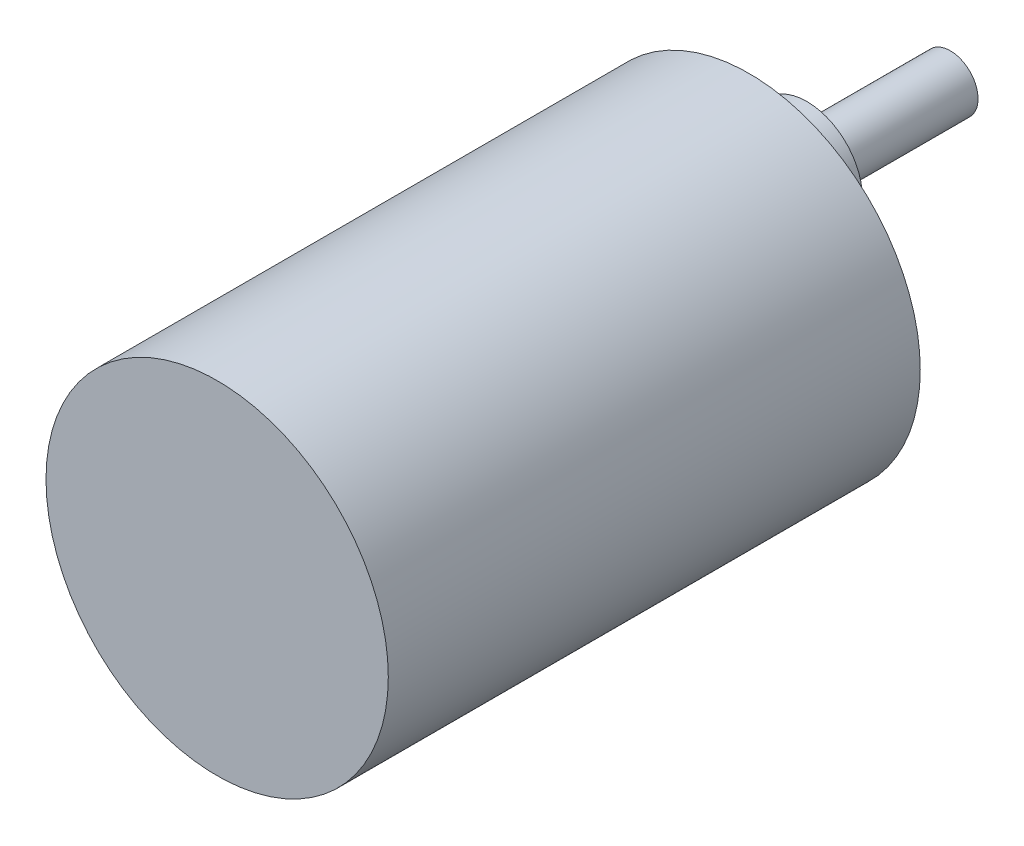
ISO-10303-21;
HEADER;
FILE_DESCRIPTION(('STEP AP214'),'2;1');
FILE_NAME('part.step','',(''),(''),'','','');
FILE_SCHEMA(('AUTOMOTIVE_DESIGN { 1 0 10303 214 1 1 1 1 }'));
ENDSEC;
DATA;
#1=APPLICATION_CONTEXT('core data for automotive mechanical design processes');
#2=APPLICATION_PROTOCOL_DEFINITION('international standard','automotive_design',2000,#1);
#3=PRODUCT_CONTEXT('',#1,'mechanical');
#4=PRODUCT('Part','Part','',(#3));
#5=PRODUCT_RELATED_PRODUCT_CATEGORY('part','',(#4));
#6=PRODUCT_DEFINITION_FORMATION('','',#4);
#7=PRODUCT_DEFINITION_CONTEXT('part definition',#1,'design');
#8=PRODUCT_DEFINITION('design','',#6,#7);
#9=PRODUCT_DEFINITION_SHAPE('','',#8);
#10=(LENGTH_UNIT() NAMED_UNIT(*) SI_UNIT(.MILLI.,.METRE.));
#11=(NAMED_UNIT(*) PLANE_ANGLE_UNIT() SI_UNIT($,.RADIAN.));
#12=(NAMED_UNIT(*) SI_UNIT($,.STERADIAN.) SOLID_ANGLE_UNIT());
#13=UNCERTAINTY_MEASURE_WITH_UNIT(LENGTH_MEASURE(1.E-05),#10,'distance_accuracy_value','');
#14=(GEOMETRIC_REPRESENTATION_CONTEXT(3) GLOBAL_UNCERTAINTY_ASSIGNED_CONTEXT((#13)) GLOBAL_UNIT_ASSIGNED_CONTEXT((#10,
#11,#12)) REPRESENTATION_CONTEXT('',''));
#15=CARTESIAN_POINT('',(0.,0.,0.));
#16=DIRECTION('',(0.,0.,1.));
#17=DIRECTION('',(1.,0.,0.));
#18=AXIS2_PLACEMENT_3D('',#15,#16,#17);
#19=CARTESIAN_POINT('',(0.,0.,46.));
#20=DIRECTION('',(0.,0.,-1.));
#21=DIRECTION('',(-1.,0.,0.));
#22=AXIS2_PLACEMENT_3D('',#19,#20,#21);
#23=CYLINDRICAL_SURFACE('',#22,18.5);
#24=CARTESIAN_POINT('',(0.,0.,0.));
#25=DIRECTION('',(0.,0.,1.));
#26=DIRECTION('',(1.,0.,0.));
#27=AXIS2_PLACEMENT_3D('',#24,#25,#26);
#28=CIRCLE('',#27,18.5);
#29=CARTESIAN_POINT('',(18.5,0.,0.));
#30=VERTEX_POINT('',#29);
#31=EDGE_CURVE('E50',#30,#30,#28,.T.);
#32=ORIENTED_EDGE('',*,*,#31,.T.);
#33=EDGE_LOOP('',(#32));
#34=FACE_BOUND('',#33,.T.);
#35=CARTESIAN_POINT('',(0.,0.,57.5));
#36=DIRECTION('',(0.,0.,1.));
#37=DIRECTION('',(1.,0.,0.));
#38=AXIS2_PLACEMENT_3D('',#35,#36,#37);
#39=CIRCLE('',#38,18.5);
#40=CARTESIAN_POINT('',(18.5,0.,57.5));
#41=VERTEX_POINT('',#40);
#42=EDGE_CURVE('E192',#41,#41,#39,.T.);
#43=ORIENTED_EDGE('',*,*,#42,.F.);
#44=EDGE_LOOP('',(#43));
#45=FACE_BOUND('',#44,.T.);
#46=ADVANCED_FACE('F37',(#34,#45),#23,.T.);
#47=CARTESIAN_POINT('',(0.,0.,0.));
#48=DIRECTION('',(0.,0.,1.));
#49=DIRECTION('',(1.,0.,0.));
#50=AXIS2_PLACEMENT_3D('',#47,#48,#49);
#51=PLANE('',#50);
#52=CARTESIAN_POINT('',(0.246542977214829,6.99565697846786,0.));
#53=DIRECTION('',(0.,0.,1.));
#54=DIRECTION('',(1.,0.,0.));
#55=AXIS2_PLACEMENT_3D('',#52,#53,#54);
#56=CIRCLE('',#55,6.);
#57=CARTESIAN_POINT('',(6.24654297721483,6.99565697846786,0.));
#58=VERTEX_POINT('',#57);
#59=EDGE_CURVE('E40',#58,#58,#56,.F.);
#60=ORIENTED_EDGE('',*,*,#59,.F.);
#61=EDGE_LOOP('',(#60));
#62=FACE_BOUND('',#61,.T.);
#63=CARTESIAN_POINT('',(15.4903833094645,-0.545916592404209,0.));
#64=DIRECTION('',(0.,0.,1.));
#65=DIRECTION('',(1.,0.,0.));
#66=AXIS2_PLACEMENT_3D('',#63,#64,#65);
#67=CIRCLE('',#66,1.5);
#68=CARTESIAN_POINT('',(16.9903833094645,-0.545916592404209,0.));
#69=VERTEX_POINT('',#68);
#70=EDGE_CURVE('E93',#69,#69,#67,.T.);
#71=ORIENTED_EDGE('',*,*,#70,.T.);
#72=EDGE_LOOP('',(#71));
#73=FACE_BOUND('',#72,.T.);
#74=CARTESIAN_POINT('',(-7.27241401736267,13.6880237565569,0.));
#75=DIRECTION('',(0.,0.,1.));
#76=DIRECTION('',(1.,0.,0.));
#77=AXIS2_PLACEMENT_3D('',#74,#75,#76);
#78=CIRCLE('',#77,1.5);
#79=CARTESIAN_POINT('',(-5.77241401736267,13.6880237565569,0.));
#80=VERTEX_POINT('',#79);
#81=EDGE_CURVE('E85',#80,#80,#78,.T.);
#82=ORIENTED_EDGE('',*,*,#81,.T.);
#83=EDGE_LOOP('',(#82));
#84=FACE_BOUND('',#83,.T.);
#85=CARTESIAN_POINT('',(8.21796929210191,13.1421071641526,0.));
#86=DIRECTION('',(0.,0.,1.));
#87=DIRECTION('',(1.,0.,0.));
#88=AXIS2_PLACEMENT_3D('',#85,#86,#87);
#89=CIRCLE('',#88,1.5);
#90=CARTESIAN_POINT('',(9.71796929210191,13.1421071641526,0.));
#91=VERTEX_POINT('',#90);
#92=EDGE_CURVE('E77',#91,#91,#89,.T.);
#93=ORIENTED_EDGE('',*,*,#92,.T.);
#94=EDGE_LOOP('',(#93));
#95=FACE_BOUND('',#94,.T.);
#96=CARTESIAN_POINT('',(-15.4903833094645,0.545916592404317,0.));
#97=DIRECTION('',(0.,0.,1.));
#98=DIRECTION('',(1.,0.,0.));
#99=AXIS2_PLACEMENT_3D('',#96,#97,#98);
#100=CIRCLE('',#99,1.5);
#101=CARTESIAN_POINT('',(-13.9903833094645,0.545916592404317,0.));
#102=VERTEX_POINT('',#101);
#103=EDGE_CURVE('E69',#102,#102,#100,.T.);
#104=ORIENTED_EDGE('',*,*,#103,.T.);
#105=EDGE_LOOP('',(#104));
#106=FACE_BOUND('',#105,.T.);
#107=CARTESIAN_POINT('',(-8.21796929210182,-13.1421071641526,0.));
#108=DIRECTION('',(0.,0.,1.));
#109=DIRECTION('',(1.,0.,0.));
#110=AXIS2_PLACEMENT_3D('',#107,#108,#109);
#111=CIRCLE('',#110,1.5);
#112=CARTESIAN_POINT('',(-6.71796929210182,-13.1421071641526,0.));
#113=VERTEX_POINT('',#112);
#114=EDGE_CURVE('E60',#113,#113,#111,.T.);
#115=ORIENTED_EDGE('',*,*,#114,.T.);
#116=EDGE_LOOP('',(#115));
#117=FACE_BOUND('',#116,.T.);
#118=CARTESIAN_POINT('',(7.27241401736276,-13.6880237565569,0.));
#119=DIRECTION('',(0.,0.,1.));
#120=DIRECTION('',(1.,0.,0.));
#121=AXIS2_PLACEMENT_3D('',#118,#119,#120);
#122=CIRCLE('',#121,1.5);
#123=CARTESIAN_POINT('',(8.77241401736276,-13.6880237565569,0.));
#124=VERTEX_POINT('',#123);
#125=EDGE_CURVE('E64',#124,#124,#122,.T.);
#126=ORIENTED_EDGE('',*,*,#125,.T.);
#127=EDGE_LOOP('',(#126));
#128=FACE_BOUND('',#127,.T.);
#129=ORIENTED_EDGE('',*,*,#31,.F.);
#130=EDGE_LOOP('',(#129));
#131=FACE_BOUND('',#130,.T.);
#132=ADVANCED_FACE('F112',(#62,#73,#84,#95,#106,#117,#128,#131),#51,.F.);
#133=CARTESIAN_POINT('',(7.27241401736276,-13.6880237565569,6.));
#134=DIRECTION('',(0.,0.,-1.));
#135=DIRECTION('',(-1.,0.,0.));
#136=AXIS2_PLACEMENT_3D('',#133,#134,#135);
#137=CYLINDRICAL_SURFACE('',#136,1.5);
#138=CARTESIAN_POINT('',(7.27241401736276,-13.6880237565569,6.));
#139=DIRECTION('',(0.,0.,1.));
#140=DIRECTION('',(1.,0.,0.));
#141=AXIS2_PLACEMENT_3D('',#138,#139,#140);
#142=CIRCLE('',#141,1.5);
#143=CARTESIAN_POINT('',(8.77241401736276,-13.6880237565569,6.));
#144=VERTEX_POINT('',#143);
#145=EDGE_CURVE('E100',#144,#144,#142,.T.);
#146=ORIENTED_EDGE('',*,*,#145,.T.);
#147=EDGE_LOOP('',(#146));
#148=FACE_BOUND('',#147,.T.);
#149=ORIENTED_EDGE('',*,*,#125,.F.);
#150=EDGE_LOOP('',(#149));
#151=FACE_BOUND('',#150,.T.);
#152=ADVANCED_FACE('F114',(#148,#151),#137,.F.);
#153=CARTESIAN_POINT('',(0.,0.,6.));
#154=DIRECTION('',(0.,0.,1.));
#155=DIRECTION('',(1.,0.,0.));
#156=AXIS2_PLACEMENT_3D('',#153,#154,#155);
#157=PLANE('',#156);
#158=ORIENTED_EDGE('',*,*,#145,.F.);
#159=EDGE_LOOP('',(#158));
#160=FACE_BOUND('',#159,.T.);
#161=ADVANCED_FACE('F120',(#160),#157,.F.);
#162=CARTESIAN_POINT('',(-8.21796929210182,-13.1421071641526,6.));
#163=DIRECTION('',(0.,0.,-1.));
#164=DIRECTION('',(-1.,0.,0.));
#165=AXIS2_PLACEMENT_3D('',#162,#163,#164);
#166=CYLINDRICAL_SURFACE('',#165,1.5);
#167=CARTESIAN_POINT('',(-8.21796929210182,-13.1421071641526,6.));
#168=DIRECTION('',(0.,0.,1.));
#169=DIRECTION('',(1.,0.,0.));
#170=AXIS2_PLACEMENT_3D('',#167,#168,#169);
#171=CIRCLE('',#170,1.5);
#172=CARTESIAN_POINT('',(-6.71796929210182,-13.1421071641526,6.));
#173=VERTEX_POINT('',#172);
#174=EDGE_CURVE('E65',#173,#173,#171,.T.);
#175=ORIENTED_EDGE('',*,*,#174,.T.);
#176=EDGE_LOOP('',(#175));
#177=FACE_BOUND('',#176,.T.);
#178=ORIENTED_EDGE('',*,*,#114,.F.);
#179=EDGE_LOOP('',(#178));
#180=FACE_BOUND('',#179,.T.);
#181=ADVANCED_FACE('F128',(#177,#180),#166,.F.);
#182=CARTESIAN_POINT('',(0.,0.,6.));
#183=DIRECTION('',(0.,0.,1.));
#184=DIRECTION('',(1.,0.,0.));
#185=AXIS2_PLACEMENT_3D('',#182,#183,#184);
#186=PLANE('',#185);
#187=ORIENTED_EDGE('',*,*,#174,.F.);
#188=EDGE_LOOP('',(#187));
#189=FACE_BOUND('',#188,.T.);
#190=ADVANCED_FACE('F162',(#189),#186,.F.);
#191=CARTESIAN_POINT('',(-15.4903833094645,0.545916592404317,6.));
#192=DIRECTION('',(0.,0.,-1.));
#193=DIRECTION('',(-1.,0.,0.));
#194=AXIS2_PLACEMENT_3D('',#191,#192,#193);
#195=CYLINDRICAL_SURFACE('',#194,1.5);
#196=CARTESIAN_POINT('',(-15.4903833094645,0.545916592404317,6.));
#197=DIRECTION('',(0.,0.,1.));
#198=DIRECTION('',(1.,0.,0.));
#199=AXIS2_PLACEMENT_3D('',#196,#197,#198);
#200=CIRCLE('',#199,1.5);
#201=CARTESIAN_POINT('',(-13.9903833094645,0.545916592404317,6.));
#202=VERTEX_POINT('',#201);
#203=EDGE_CURVE('E73',#202,#202,#200,.T.);
#204=ORIENTED_EDGE('',*,*,#203,.T.);
#205=EDGE_LOOP('',(#204));
#206=FACE_BOUND('',#205,.T.);
#207=ORIENTED_EDGE('',*,*,#103,.F.);
#208=EDGE_LOOP('',(#207));
#209=FACE_BOUND('',#208,.T.);
#210=ADVANCED_FACE('F158',(#206,#209),#195,.F.);
#211=CARTESIAN_POINT('',(0.,0.,6.));
#212=DIRECTION('',(0.,0.,1.));
#213=DIRECTION('',(1.,0.,0.));
#214=AXIS2_PLACEMENT_3D('',#211,#212,#213);
#215=PLANE('',#214);
#216=ORIENTED_EDGE('',*,*,#203,.F.);
#217=EDGE_LOOP('',(#216));
#218=FACE_BOUND('',#217,.T.);
#219=ADVANCED_FACE('F154',(#218),#215,.F.);
#220=CARTESIAN_POINT('',(8.21796929210191,13.1421071641526,6.));
#221=DIRECTION('',(0.,0.,-1.));
#222=DIRECTION('',(-1.,0.,0.));
#223=AXIS2_PLACEMENT_3D('',#220,#221,#222);
#224=CYLINDRICAL_SURFACE('',#223,1.5);
#225=CARTESIAN_POINT('',(8.21796929210191,13.1421071641526,6.));
#226=DIRECTION('',(0.,0.,1.));
#227=DIRECTION('',(1.,0.,0.));
#228=AXIS2_PLACEMENT_3D('',#225,#226,#227);
#229=CIRCLE('',#228,1.5);
#230=CARTESIAN_POINT('',(9.71796929210191,13.1421071641526,6.));
#231=VERTEX_POINT('',#230);
#232=EDGE_CURVE('E81',#231,#231,#229,.T.);
#233=ORIENTED_EDGE('',*,*,#232,.T.);
#234=EDGE_LOOP('',(#233));
#235=FACE_BOUND('',#234,.T.);
#236=ORIENTED_EDGE('',*,*,#92,.F.);
#237=EDGE_LOOP('',(#236));
#238=FACE_BOUND('',#237,.T.);
#239=ADVANCED_FACE('F150',(#235,#238),#224,.F.);
#240=CARTESIAN_POINT('',(0.,0.,6.));
#241=DIRECTION('',(0.,0.,1.));
#242=DIRECTION('',(1.,0.,0.));
#243=AXIS2_PLACEMENT_3D('',#240,#241,#242);
#244=PLANE('',#243);
#245=ORIENTED_EDGE('',*,*,#232,.F.);
#246=EDGE_LOOP('',(#245));
#247=FACE_BOUND('',#246,.T.);
#248=ADVANCED_FACE('F146',(#247),#244,.F.);
#249=CARTESIAN_POINT('',(-7.27241401736267,13.6880237565569,6.));
#250=DIRECTION('',(0.,0.,-1.));
#251=DIRECTION('',(-1.,0.,0.));
#252=AXIS2_PLACEMENT_3D('',#249,#250,#251);
#253=CYLINDRICAL_SURFACE('',#252,1.5);
#254=CARTESIAN_POINT('',(-7.27241401736267,13.6880237565569,6.));
#255=DIRECTION('',(0.,0.,1.));
#256=DIRECTION('',(1.,0.,0.));
#257=AXIS2_PLACEMENT_3D('',#254,#255,#256);
#258=CIRCLE('',#257,1.5);
#259=CARTESIAN_POINT('',(-5.77241401736267,13.6880237565569,6.));
#260=VERTEX_POINT('',#259);
#261=EDGE_CURVE('E89',#260,#260,#258,.T.);
#262=ORIENTED_EDGE('',*,*,#261,.T.);
#263=EDGE_LOOP('',(#262));
#264=FACE_BOUND('',#263,.T.);
#265=ORIENTED_EDGE('',*,*,#81,.F.);
#266=EDGE_LOOP('',(#265));
#267=FACE_BOUND('',#266,.T.);
#268=ADVANCED_FACE('F142',(#264,#267),#253,.F.);
#269=CARTESIAN_POINT('',(0.,0.,6.));
#270=DIRECTION('',(0.,0.,1.));
#271=DIRECTION('',(1.,0.,0.));
#272=AXIS2_PLACEMENT_3D('',#269,#270,#271);
#273=PLANE('',#272);
#274=ORIENTED_EDGE('',*,*,#261,.F.);
#275=EDGE_LOOP('',(#274));
#276=FACE_BOUND('',#275,.T.);
#277=ADVANCED_FACE('F138',(#276),#273,.F.);
#278=CARTESIAN_POINT('',(15.4903833094645,-0.545916592404209,6.));
#279=DIRECTION('',(0.,0.,-1.));
#280=DIRECTION('',(-1.,0.,0.));
#281=AXIS2_PLACEMENT_3D('',#278,#279,#280);
#282=CYLINDRICAL_SURFACE('',#281,1.5);
#283=CARTESIAN_POINT('',(15.4903833094645,-0.545916592404209,6.));
#284=DIRECTION('',(0.,0.,1.));
#285=DIRECTION('',(1.,0.,0.));
#286=AXIS2_PLACEMENT_3D('',#283,#284,#285);
#287=CIRCLE('',#286,1.5);
#288=CARTESIAN_POINT('',(16.9903833094645,-0.545916592404209,6.));
#289=VERTEX_POINT('',#288);
#290=EDGE_CURVE('E59',#289,#289,#287,.T.);
#291=ORIENTED_EDGE('',*,*,#290,.T.);
#292=EDGE_LOOP('',(#291));
#293=FACE_BOUND('',#292,.T.);
#294=ORIENTED_EDGE('',*,*,#70,.F.);
#295=EDGE_LOOP('',(#294));
#296=FACE_BOUND('',#295,.T.);
#297=ADVANCED_FACE('F134',(#293,#296),#282,.F.);
#298=CARTESIAN_POINT('',(15.4903833094645,-0.545916592404209,6.));
#299=DIRECTION('',(0.,0.,1.));
#300=DIRECTION('',(1.,0.,0.));
#301=AXIS2_PLACEMENT_3D('',#298,#299,#300);
#302=PLANE('',#301);
#303=ORIENTED_EDGE('',*,*,#290,.F.);
#304=EDGE_LOOP('',(#303));
#305=FACE_BOUND('',#304,.T.);
#306=ADVANCED_FACE('F130',(#305),#302,.F.);
#307=CARTESIAN_POINT('',(0.246542977214829,6.99565697846786,-6.));
#308=DIRECTION('',(0.,0.,1.));
#309=DIRECTION('',(1.,0.,0.));
#310=AXIS2_PLACEMENT_3D('',#307,#308,#309);
#311=CYLINDRICAL_SURFACE('',#310,6.);
#312=CARTESIAN_POINT('',(0.246542977214829,6.99565697846786,-6.));
#313=DIRECTION('',(0.,0.,-1.));
#314=DIRECTION('',(-1.,0.,0.));
#315=AXIS2_PLACEMENT_3D('',#312,#313,#314);
#316=CIRCLE('',#315,6.);
#317=CARTESIAN_POINT('',(-5.75345702278517,6.99565697846786,-6.));
#318=VERTEX_POINT('',#317);
#319=EDGE_CURVE('E55',#318,#318,#316,.T.);
#320=ORIENTED_EDGE('',*,*,#319,.F.);
#321=EDGE_LOOP('',(#320));
#322=FACE_BOUND('',#321,.T.);
#323=ORIENTED_EDGE('',*,*,#59,.T.);
#324=EDGE_LOOP('',(#323));
#325=FACE_BOUND('',#324,.T.);
#326=ADVANCED_FACE('F133',(#322,#325),#311,.T.);
#327=CARTESIAN_POINT('',(0.246542977214829,6.99565697846786,-6.));
#328=DIRECTION('',(0.,0.,-1.));
#329=DIRECTION('',(-1.,0.,0.));
#330=AXIS2_PLACEMENT_3D('',#327,#328,#329);
#331=PLANE('',#330);
#332=CARTESIAN_POINT('',(0.246542977214829,6.99565697846786,-6.));
#333=DIRECTION('',(0.,0.,-1.));
#334=DIRECTION('',(-1.,0.,0.));
#335=AXIS2_PLACEMENT_3D('',#332,#333,#334);
#336=CIRCLE('',#335,3.);
#337=CARTESIAN_POINT('',(-2.75345702278517,6.99565697846786,-6.));
#338=VERTEX_POINT('',#337);
#339=EDGE_CURVE('E10',#338,#338,#336,.T.);
#340=ORIENTED_EDGE('',*,*,#339,.F.);
#341=EDGE_LOOP('',(#340));
#342=FACE_BOUND('',#341,.T.);
#343=ORIENTED_EDGE('',*,*,#319,.T.);
#344=EDGE_LOOP('',(#343));
#345=FACE_BOUND('',#344,.T.);
#346=ADVANCED_FACE('F172',(#342,#345),#331,.T.);
#347=CARTESIAN_POINT('',(0.246542977214829,6.99565697846786,-21.5));
#348=DIRECTION('',(0.,0.,1.));
#349=DIRECTION('',(1.,0.,0.));
#350=AXIS2_PLACEMENT_3D('',#347,#348,#349);
#351=CYLINDRICAL_SURFACE('',#350,3.);
#352=CARTESIAN_POINT('',(0.246542977214829,6.99565697846786,-21.5));
#353=DIRECTION('',(0.,0.,-1.));
#354=DIRECTION('',(-1.,0.,0.));
#355=AXIS2_PLACEMENT_3D('',#352,#353,#354);
#356=CIRCLE('',#355,3.);
#357=CARTESIAN_POINT('',(-2.75345702278517,6.99565697846786,-21.5));
#358=VERTEX_POINT('',#357);
#359=EDGE_CURVE('E53',#358,#358,#356,.T.);
#360=ORIENTED_EDGE('',*,*,#359,.F.);
#361=EDGE_LOOP('',(#360));
#362=FACE_BOUND('',#361,.T.);
#363=ORIENTED_EDGE('',*,*,#339,.T.);
#364=EDGE_LOOP('',(#363));
#365=FACE_BOUND('',#364,.T.);
#366=ADVANCED_FACE('F176',(#362,#365),#351,.T.);
#367=CARTESIAN_POINT('',(0.246542977214829,6.99565697846786,-21.5));
#368=DIRECTION('',(0.,0.,-1.));
#369=DIRECTION('',(-1.,0.,0.));
#370=AXIS2_PLACEMENT_3D('',#367,#368,#369);
#371=PLANE('',#370);
#372=ORIENTED_EDGE('',*,*,#359,.T.);
#373=EDGE_LOOP('',(#372));
#374=FACE_BOUND('',#373,.T.);
#375=ADVANCED_FACE('F180',(#374),#371,.T.);
#376=CARTESIAN_POINT('',(0.,0.,57.5));
#377=DIRECTION('',(0.,0.,1.));
#378=DIRECTION('',(1.,0.,0.));
#379=AXIS2_PLACEMENT_3D('',#376,#377,#378);
#380=PLANE('',#379);
#381=ORIENTED_EDGE('',*,*,#42,.T.);
#382=EDGE_LOOP('',(#381));
#383=FACE_BOUND('',#382,.T.);
#384=ADVANCED_FACE('F184',(#383),#380,.T.);
#385=CLOSED_SHELL('',(#46,#132,#152,#161,#181,#190,#210,#219,#239,#248,#268,#277,#297,#306,#326,
#346,#366,#375,#384));
#386=MANIFOLD_SOLID_BREP('B2',#385);
#387=ADVANCED_BREP_SHAPE_REPRESENTATION('',(#18,#386),#14);
#388=SHAPE_DEFINITION_REPRESENTATION(#9,#387);
ENDSEC;
END-ISO-10303-21;
